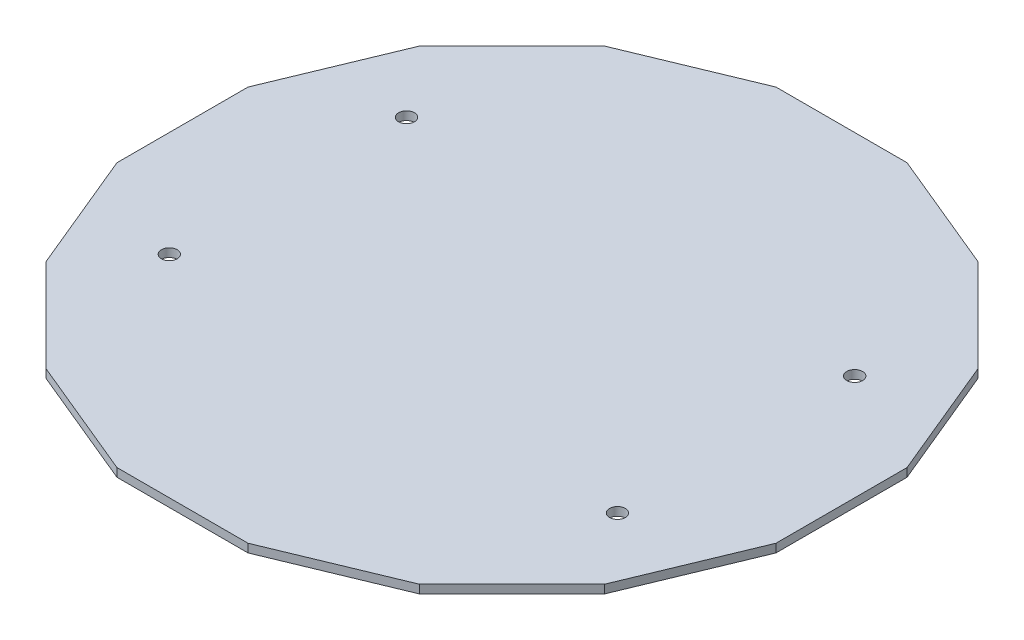
ISO-10303-21;
HEADER;
FILE_DESCRIPTION(('STEP AP214'),'2;1');
FILE_NAME('part.step','',(''),(''),'','','');
FILE_SCHEMA(('AUTOMOTIVE_DESIGN { 1 0 10303 214 1 1 1 1 }'));
ENDSEC;
DATA;
#1=APPLICATION_CONTEXT('core data for automotive mechanical design processes');
#2=APPLICATION_PROTOCOL_DEFINITION('international standard','automotive_design',2000,#1);
#3=PRODUCT_CONTEXT('',#1,'mechanical');
#4=PRODUCT('Part','Part','',(#3));
#5=PRODUCT_RELATED_PRODUCT_CATEGORY('part','',(#4));
#6=PRODUCT_DEFINITION_FORMATION('','',#4);
#7=PRODUCT_DEFINITION_CONTEXT('part definition',#1,'design');
#8=PRODUCT_DEFINITION('design','',#6,#7);
#9=PRODUCT_DEFINITION_SHAPE('','',#8);
#10=(LENGTH_UNIT() NAMED_UNIT(*) SI_UNIT(.MILLI.,.METRE.));
#11=(NAMED_UNIT(*) PLANE_ANGLE_UNIT() SI_UNIT($,.RADIAN.));
#12=(NAMED_UNIT(*) SI_UNIT($,.STERADIAN.) SOLID_ANGLE_UNIT());
#13=UNCERTAINTY_MEASURE_WITH_UNIT(LENGTH_MEASURE(1.E-05),#10,'distance_accuracy_value','');
#14=(GEOMETRIC_REPRESENTATION_CONTEXT(3) GLOBAL_UNCERTAINTY_ASSIGNED_CONTEXT((#13)) GLOBAL_UNIT_ASSIGNED_CONTEXT((#10,
#11,#12)) REPRESENTATION_CONTEXT('',''));
#15=CARTESIAN_POINT('',(0.,0.,0.));
#16=DIRECTION('',(0.,0.,1.));
#17=DIRECTION('',(1.,0.,0.));
#18=AXIS2_PLACEMENT_3D('',#15,#16,#17);
#19=CARTESIAN_POINT('',(62.5,1.6,12.4320229612286));
#20=DIRECTION('',(-1.,0.,0.));
#21=DIRECTION('',(0.,0.,1.));
#22=AXIS2_PLACEMENT_3D('',#19,#20,#21);
#23=PLANE('',#22);
#24=DIRECTION('',(0.,0.,-1.));
#25=VECTOR('',#24,1.);
#26=CARTESIAN_POINT('',(62.5,0.,12.4320229612286));
#27=LINE('',#26,#25);
#28=CARTESIAN_POINT('',(62.5,0.,12.4320229612286));
#29=VERTEX_POINT('',#28);
#30=CARTESIAN_POINT('',(62.5,0.,-12.4320229612286));
#31=VERTEX_POINT('',#30);
#32=EDGE_CURVE('E199',#29,#31,#27,.T.);
#33=ORIENTED_EDGE('',*,*,#32,.T.);
#34=DIRECTION('',(0.,-1.,0.));
#35=VECTOR('',#34,1.);
#36=CARTESIAN_POINT('',(62.5,1.6,-12.4320229612286));
#37=LINE('',#36,#35);
#38=CARTESIAN_POINT('',(62.5,1.6,-12.4320229612286));
#39=VERTEX_POINT('',#38);
#40=EDGE_CURVE('E11',#39,#31,#37,.T.);
#41=ORIENTED_EDGE('',*,*,#40,.F.);
#42=DIRECTION('',(0.,0.,-1.));
#43=VECTOR('',#42,1.);
#44=CARTESIAN_POINT('',(62.5,1.6,12.4320229612286));
#45=LINE('',#44,#43);
#46=CARTESIAN_POINT('',(62.5,1.6,12.4320229612286));
#47=VERTEX_POINT('',#46);
#48=EDGE_CURVE('E246',#47,#39,#45,.T.);
#49=ORIENTED_EDGE('',*,*,#48,.F.);
#50=DIRECTION('',(0.,-1.,0.));
#51=VECTOR('',#50,1.);
#52=CARTESIAN_POINT('',(62.5,1.6,12.4320229612286));
#53=LINE('',#52,#51);
#54=EDGE_CURVE('E195',#47,#29,#53,.T.);
#55=ORIENTED_EDGE('',*,*,#54,.T.);
#56=EDGE_LOOP('',(#33,#41,#49,#55));
#57=FACE_BOUND('',#56,.T.);
#58=ADVANCED_FACE('F50',(#57),#23,.F.);
#59=CARTESIAN_POINT('',(62.5,1.6,-12.4320229612286));
#60=DIRECTION('',(-0.923879532511287,0.,0.38268343236509));
#61=DIRECTION('',(0.38268343236509,0.,0.923879532511287));
#62=AXIS2_PLACEMENT_3D('',#59,#60,#61);
#63=PLANE('',#62);
#64=DIRECTION('',(-0.38268343236509,0.,-0.923879532511287));
#65=VECTOR('',#64,1.);
#66=CARTESIAN_POINT('',(62.5,0.,-12.4320229612286));
#67=LINE('',#66,#65);
#68=CARTESIAN_POINT('',(52.9849415639108,0.,-35.4034060844076));
#69=VERTEX_POINT('',#68);
#70=EDGE_CURVE('E203',#31,#69,#67,.T.);
#71=ORIENTED_EDGE('',*,*,#70,.T.);
#72=DIRECTION('',(0.,-1.,0.));
#73=VECTOR('',#72,1.);
#74=CARTESIAN_POINT('',(52.9849415639108,1.6,-35.4034060844076));
#75=LINE('',#74,#73);
#76=CARTESIAN_POINT('',(52.9849415639108,1.6,-35.4034060844076));
#77=VERTEX_POINT('',#76);
#78=EDGE_CURVE('E59',#77,#69,#75,.T.);
#79=ORIENTED_EDGE('',*,*,#78,.F.);
#80=DIRECTION('',(-0.38268343236509,0.,-0.923879532511287));
#81=VECTOR('',#80,1.);
#82=CARTESIAN_POINT('',(62.5,1.6,-12.4320229612286));
#83=LINE('',#82,#81);
#84=EDGE_CURVE('E134',#39,#77,#83,.T.);
#85=ORIENTED_EDGE('',*,*,#84,.F.);
#86=ORIENTED_EDGE('',*,*,#40,.T.);
#87=EDGE_LOOP('',(#71,#79,#85,#86));
#88=FACE_BOUND('',#87,.T.);
#89=ADVANCED_FACE('F369',(#88),#63,.F.);
#90=CARTESIAN_POINT('',(52.9849415639108,1.6,-35.4034060844076));
#91=DIRECTION('',(-0.707106781186548,0.,0.707106781186548));
#92=DIRECTION('',(0.707106781186548,0.,0.707106781186548));
#93=AXIS2_PLACEMENT_3D('',#90,#91,#92);
#94=PLANE('',#93);
#95=DIRECTION('',(-0.707106781186547,0.,-0.707106781186547));
#96=VECTOR('',#95,1.);
#97=CARTESIAN_POINT('',(52.9849415639108,0.,-35.4034060844076));
#98=LINE('',#97,#96);
#99=CARTESIAN_POINT('',(35.4034060844076,0.,-52.9849415639108));
#100=VERTEX_POINT('',#99);
#101=EDGE_CURVE('E207',#69,#100,#98,.T.);
#102=ORIENTED_EDGE('',*,*,#101,.T.);
#103=DIRECTION('',(0.,-1.,0.));
#104=VECTOR('',#103,1.);
#105=CARTESIAN_POINT('',(35.4034060844076,1.6,-52.9849415639108));
#106=LINE('',#105,#104);
#107=CARTESIAN_POINT('',(35.4034060844076,1.6,-52.9849415639108));
#108=VERTEX_POINT('',#107);
#109=EDGE_CURVE('E289',#108,#100,#106,.T.);
#110=ORIENTED_EDGE('',*,*,#109,.F.);
#111=DIRECTION('',(-0.707106781186547,0.,-0.707106781186547));
#112=VECTOR('',#111,1.);
#113=CARTESIAN_POINT('',(52.9849415639108,1.6,-35.4034060844076));
#114=LINE('',#113,#112);
#115=EDGE_CURVE('E299',#77,#108,#114,.T.);
#116=ORIENTED_EDGE('',*,*,#115,.F.);
#117=ORIENTED_EDGE('',*,*,#78,.T.);
#118=EDGE_LOOP('',(#102,#110,#116,#117));
#119=FACE_BOUND('',#118,.T.);
#120=ADVANCED_FACE('F297',(#119),#94,.F.);
#121=CARTESIAN_POINT('',(35.4034060844076,1.6,-52.9849415639108));
#122=DIRECTION('',(-0.382683432365089,0.,0.923879532511287));
#123=DIRECTION('',(0.923879532511287,0.,0.382683432365089));
#124=AXIS2_PLACEMENT_3D('',#121,#122,#123);
#125=PLANE('',#124);
#126=DIRECTION('',(-0.923879532511287,0.,-0.382683432365089));
#127=VECTOR('',#126,1.);
#128=CARTESIAN_POINT('',(35.4034060844076,0.,-52.9849415639108));
#129=LINE('',#128,#127);
#130=CARTESIAN_POINT('',(12.4320229612286,0.,-62.5));
#131=VERTEX_POINT('',#130);
#132=EDGE_CURVE('E210',#100,#131,#129,.T.);
#133=ORIENTED_EDGE('',*,*,#132,.T.);
#134=DIRECTION('',(0.,-1.,0.));
#135=VECTOR('',#134,1.);
#136=CARTESIAN_POINT('',(12.4320229612286,1.6,-62.5));
#137=LINE('',#136,#135);
#138=CARTESIAN_POINT('',(12.4320229612286,1.6,-62.5));
#139=VERTEX_POINT('',#138);
#140=EDGE_CURVE('E285',#139,#131,#137,.T.);
#141=ORIENTED_EDGE('',*,*,#140,.F.);
#142=DIRECTION('',(-0.923879532511287,0.,-0.382683432365089));
#143=VECTOR('',#142,1.);
#144=CARTESIAN_POINT('',(35.4034060844076,1.6,-52.9849415639108));
#145=LINE('',#144,#143);
#146=EDGE_CURVE('E318',#108,#139,#145,.T.);
#147=ORIENTED_EDGE('',*,*,#146,.F.);
#148=ORIENTED_EDGE('',*,*,#109,.T.);
#149=EDGE_LOOP('',(#133,#141,#147,#148));
#150=FACE_BOUND('',#149,.T.);
#151=ADVANCED_FACE('F308',(#150),#125,.F.);
#152=CARTESIAN_POINT('',(12.4320229612286,1.6,-62.5));
#153=DIRECTION('',(0.,0.,1.));
#154=DIRECTION('',(1.,0.,0.));
#155=AXIS2_PLACEMENT_3D('',#152,#153,#154);
#156=PLANE('',#155);
#157=DIRECTION('',(-1.,0.,0.));
#158=VECTOR('',#157,1.);
#159=CARTESIAN_POINT('',(12.4320229612286,0.,-62.5));
#160=LINE('',#159,#158);
#161=CARTESIAN_POINT('',(-12.4320229612286,0.,-62.5));
#162=VERTEX_POINT('',#161);
#163=EDGE_CURVE('E213',#131,#162,#160,.T.);
#164=ORIENTED_EDGE('',*,*,#163,.T.);
#165=DIRECTION('',(0.,-1.,0.));
#166=VECTOR('',#165,1.);
#167=CARTESIAN_POINT('',(-12.4320229612286,1.6,-62.5));
#168=LINE('',#167,#166);
#169=CARTESIAN_POINT('',(-12.4320229612286,1.6,-62.5));
#170=VERTEX_POINT('',#169);
#171=EDGE_CURVE('E281',#170,#162,#168,.T.);
#172=ORIENTED_EDGE('',*,*,#171,.F.);
#173=DIRECTION('',(-1.,0.,0.));
#174=VECTOR('',#173,1.);
#175=CARTESIAN_POINT('',(12.4320229612286,1.6,-62.5));
#176=LINE('',#175,#174);
#177=EDGE_CURVE('E314',#139,#170,#176,.T.);
#178=ORIENTED_EDGE('',*,*,#177,.F.);
#179=ORIENTED_EDGE('',*,*,#140,.T.);
#180=EDGE_LOOP('',(#164,#172,#178,#179));
#181=FACE_BOUND('',#180,.T.);
#182=ADVANCED_FACE('F312',(#181),#156,.F.);
#183=CARTESIAN_POINT('',(-12.4320229612286,1.6,-62.5));
#184=DIRECTION('',(0.38268343236509,0.,0.923879532511287));
#185=DIRECTION('',(0.923879532511287,0.,-0.38268343236509));
#186=AXIS2_PLACEMENT_3D('',#183,#184,#185);
#187=PLANE('',#186);
#188=DIRECTION('',(-0.923879532511287,0.,0.38268343236509));
#189=VECTOR('',#188,1.);
#190=CARTESIAN_POINT('',(-12.4320229612286,0.,-62.5));
#191=LINE('',#190,#189);
#192=CARTESIAN_POINT('',(-35.4034060844076,0.,-52.9849415639108));
#193=VERTEX_POINT('',#192);
#194=EDGE_CURVE('E216',#162,#193,#191,.T.);
#195=ORIENTED_EDGE('',*,*,#194,.T.);
#196=DIRECTION('',(0.,-1.,0.));
#197=VECTOR('',#196,1.);
#198=CARTESIAN_POINT('',(-35.4034060844076,1.6,-52.9849415639108));
#199=LINE('',#198,#197);
#200=CARTESIAN_POINT('',(-35.4034060844076,1.6,-52.9849415639108));
#201=VERTEX_POINT('',#200);
#202=EDGE_CURVE('E277',#201,#193,#199,.T.);
#203=ORIENTED_EDGE('',*,*,#202,.F.);
#204=DIRECTION('',(-0.923879532511287,0.,0.38268343236509));
#205=VECTOR('',#204,1.);
#206=CARTESIAN_POINT('',(-12.4320229612286,1.6,-62.5));
#207=LINE('',#206,#205);
#208=EDGE_CURVE('E317',#170,#201,#207,.T.);
#209=ORIENTED_EDGE('',*,*,#208,.F.);
#210=ORIENTED_EDGE('',*,*,#171,.T.);
#211=EDGE_LOOP('',(#195,#203,#209,#210));
#212=FACE_BOUND('',#211,.T.);
#213=ADVANCED_FACE('F382',(#212),#187,.F.);
#214=CARTESIAN_POINT('',(-35.4034060844076,1.6,-52.9849415639108));
#215=DIRECTION('',(0.707106781186548,0.,0.707106781186547));
#216=DIRECTION('',(0.707106781186547,0.,-0.707106781186548));
#217=AXIS2_PLACEMENT_3D('',#214,#215,#216);
#218=PLANE('',#217);
#219=DIRECTION('',(-0.707106781186547,0.,0.707106781186548));
#220=VECTOR('',#219,1.);
#221=CARTESIAN_POINT('',(-35.4034060844076,0.,-52.9849415639108));
#222=LINE('',#221,#220);
#223=CARTESIAN_POINT('',(-52.9849415639109,0.,-35.4034060844075));
#224=VERTEX_POINT('',#223);
#225=EDGE_CURVE('E219',#193,#224,#222,.T.);
#226=ORIENTED_EDGE('',*,*,#225,.T.);
#227=DIRECTION('',(0.,-1.,0.));
#228=VECTOR('',#227,1.);
#229=CARTESIAN_POINT('',(-52.9849415639109,1.6,-35.4034060844075));
#230=LINE('',#229,#228);
#231=CARTESIAN_POINT('',(-52.9849415639109,1.6,-35.4034060844075));
#232=VERTEX_POINT('',#231);
#233=EDGE_CURVE('E273',#232,#224,#230,.T.);
#234=ORIENTED_EDGE('',*,*,#233,.F.);
#235=DIRECTION('',(-0.707106781186547,0.,0.707106781186548));
#236=VECTOR('',#235,1.);
#237=CARTESIAN_POINT('',(-35.4034060844076,1.6,-52.9849415639108));
#238=LINE('',#237,#236);
#239=EDGE_CURVE('E322',#201,#232,#238,.T.);
#240=ORIENTED_EDGE('',*,*,#239,.F.);
#241=ORIENTED_EDGE('',*,*,#202,.T.);
#242=EDGE_LOOP('',(#226,#234,#240,#241));
#243=FACE_BOUND('',#242,.T.);
#244=ADVANCED_FACE('F385',(#243),#218,.F.);
#245=CARTESIAN_POINT('',(-52.9849415639109,1.6,-35.4034060844075));
#246=DIRECTION('',(0.923879532511287,0.,0.382683432365089));
#247=DIRECTION('',(0.38268343236509,0.,-0.923879532511287));
#248=AXIS2_PLACEMENT_3D('',#245,#246,#247);
#249=PLANE('',#248);
#250=DIRECTION('',(-0.382683432365089,0.,0.923879532511287));
#251=VECTOR('',#250,1.);
#252=CARTESIAN_POINT('',(-52.9849415639109,0.,-35.4034060844075));
#253=LINE('',#252,#251);
#254=CARTESIAN_POINT('',(-62.5,0.,-12.4320229612286));
#255=VERTEX_POINT('',#254);
#256=EDGE_CURVE('E222',#224,#255,#253,.T.);
#257=ORIENTED_EDGE('',*,*,#256,.T.);
#258=DIRECTION('',(0.,-1.,0.));
#259=VECTOR('',#258,1.);
#260=CARTESIAN_POINT('',(-62.5,1.6,-12.4320229612286));
#261=LINE('',#260,#259);
#262=CARTESIAN_POINT('',(-62.5,1.6,-12.4320229612286));
#263=VERTEX_POINT('',#262);
#264=EDGE_CURVE('E269',#263,#255,#261,.T.);
#265=ORIENTED_EDGE('',*,*,#264,.F.);
#266=DIRECTION('',(-0.382683432365089,0.,0.923879532511287));
#267=VECTOR('',#266,1.);
#268=CARTESIAN_POINT('',(-52.9849415639109,1.6,-35.4034060844075));
#269=LINE('',#268,#267);
#270=EDGE_CURVE('E329',#232,#263,#269,.T.);
#271=ORIENTED_EDGE('',*,*,#270,.F.);
#272=ORIENTED_EDGE('',*,*,#233,.T.);
#273=EDGE_LOOP('',(#257,#265,#271,#272));
#274=FACE_BOUND('',#273,.T.);
#275=ADVANCED_FACE('F389',(#274),#249,.F.);
#276=CARTESIAN_POINT('',(-62.5,1.6,-12.4320229612286));
#277=DIRECTION('',(1.,0.,0.));
#278=DIRECTION('',(0.,0.,-1.));
#279=AXIS2_PLACEMENT_3D('',#276,#277,#278);
#280=PLANE('',#279);
#281=DIRECTION('',(0.,0.,1.));
#282=VECTOR('',#281,1.);
#283=CARTESIAN_POINT('',(-62.5,0.,-12.4320229612286));
#284=LINE('',#283,#282);
#285=CARTESIAN_POINT('',(-62.5,0.,12.4320229612287));
#286=VERTEX_POINT('',#285);
#287=EDGE_CURVE('E225',#255,#286,#284,.T.);
#288=ORIENTED_EDGE('',*,*,#287,.T.);
#289=DIRECTION('',(0.,-1.,0.));
#290=VECTOR('',#289,1.);
#291=CARTESIAN_POINT('',(-62.5,1.6,12.4320229612287));
#292=LINE('',#291,#290);
#293=CARTESIAN_POINT('',(-62.5,1.6,12.4320229612287));
#294=VERTEX_POINT('',#293);
#295=EDGE_CURVE('E265',#294,#286,#292,.T.);
#296=ORIENTED_EDGE('',*,*,#295,.F.);
#297=DIRECTION('',(0.,0.,1.));
#298=VECTOR('',#297,1.);
#299=CARTESIAN_POINT('',(-62.5,1.6,-12.4320229612286));
#300=LINE('',#299,#298);
#301=EDGE_CURVE('E332',#263,#294,#300,.T.);
#302=ORIENTED_EDGE('',*,*,#301,.F.);
#303=ORIENTED_EDGE('',*,*,#264,.T.);
#304=EDGE_LOOP('',(#288,#296,#302,#303));
#305=FACE_BOUND('',#304,.T.);
#306=ADVANCED_FACE('F393',(#305),#280,.F.);
#307=CARTESIAN_POINT('',(-62.5,1.6,12.4320229612287));
#308=DIRECTION('',(0.923879532511287,0.,-0.38268343236509));
#309=DIRECTION('',(-0.38268343236509,0.,-0.923879532511287));
#310=AXIS2_PLACEMENT_3D('',#307,#308,#309);
#311=PLANE('',#310);
#312=DIRECTION('',(0.38268343236509,0.,0.923879532511287));
#313=VECTOR('',#312,1.);
#314=CARTESIAN_POINT('',(-62.5,0.,12.4320229612287));
#315=LINE('',#314,#313);
#316=CARTESIAN_POINT('',(-52.9849415639108,0.,35.4034060844077));
#317=VERTEX_POINT('',#316);
#318=EDGE_CURVE('E228',#286,#317,#315,.T.);
#319=ORIENTED_EDGE('',*,*,#318,.T.);
#320=DIRECTION('',(0.,-1.,0.));
#321=VECTOR('',#320,1.);
#322=CARTESIAN_POINT('',(-52.9849415639108,1.6,35.4034060844077));
#323=LINE('',#322,#321);
#324=CARTESIAN_POINT('',(-52.9849415639108,1.6,35.4034060844077));
#325=VERTEX_POINT('',#324);
#326=EDGE_CURVE('E261',#325,#317,#323,.T.);
#327=ORIENTED_EDGE('',*,*,#326,.F.);
#328=DIRECTION('',(0.38268343236509,0.,0.923879532511287));
#329=VECTOR('',#328,1.);
#330=CARTESIAN_POINT('',(-62.5,1.6,12.4320229612287));
#331=LINE('',#330,#329);
#332=EDGE_CURVE('E335',#294,#325,#331,.T.);
#333=ORIENTED_EDGE('',*,*,#332,.F.);
#334=ORIENTED_EDGE('',*,*,#295,.T.);
#335=EDGE_LOOP('',(#319,#327,#333,#334));
#336=FACE_BOUND('',#335,.T.);
#337=ADVANCED_FACE('F397',(#336),#311,.F.);
#338=CARTESIAN_POINT('',(-52.9849415639108,1.6,35.4034060844077));
#339=DIRECTION('',(0.707106781186547,0.,-0.707106781186548));
#340=DIRECTION('',(-0.707106781186548,0.,-0.707106781186547));
#341=AXIS2_PLACEMENT_3D('',#338,#339,#340);
#342=PLANE('',#341);
#343=DIRECTION('',(0.707106781186548,0.,0.707106781186547));
#344=VECTOR('',#343,1.);
#345=CARTESIAN_POINT('',(-52.9849415639108,0.,35.4034060844077));
#346=LINE('',#345,#344);
#347=CARTESIAN_POINT('',(-35.4034060844076,0.,52.9849415639109));
#348=VERTEX_POINT('',#347);
#349=EDGE_CURVE('E231',#317,#348,#346,.T.);
#350=ORIENTED_EDGE('',*,*,#349,.T.);
#351=DIRECTION('',(0.,-1.,0.));
#352=VECTOR('',#351,1.);
#353=CARTESIAN_POINT('',(-35.4034060844076,1.6,52.9849415639109));
#354=LINE('',#353,#352);
#355=CARTESIAN_POINT('',(-35.4034060844076,1.6,52.9849415639109));
#356=VERTEX_POINT('',#355);
#357=EDGE_CURVE('E257',#356,#348,#354,.T.);
#358=ORIENTED_EDGE('',*,*,#357,.F.);
#359=DIRECTION('',(0.707106781186548,0.,0.707106781186547));
#360=VECTOR('',#359,1.);
#361=CARTESIAN_POINT('',(-52.9849415639108,1.6,35.4034060844077));
#362=LINE('',#361,#360);
#363=EDGE_CURVE('E338',#325,#356,#362,.T.);
#364=ORIENTED_EDGE('',*,*,#363,.F.);
#365=ORIENTED_EDGE('',*,*,#326,.T.);
#366=EDGE_LOOP('',(#350,#358,#364,#365));
#367=FACE_BOUND('',#366,.T.);
#368=ADVANCED_FACE('F401',(#367),#342,.F.);
#369=CARTESIAN_POINT('',(-35.4034060844076,1.6,52.9849415639109));
#370=DIRECTION('',(0.382683432365089,0.,-0.923879532511287));
#371=DIRECTION('',(-0.923879532511287,0.,-0.382683432365089));
#372=AXIS2_PLACEMENT_3D('',#369,#370,#371);
#373=PLANE('',#372);
#374=DIRECTION('',(0.923879532511287,0.,0.382683432365089));
#375=VECTOR('',#374,1.);
#376=CARTESIAN_POINT('',(-35.4034060844076,0.,52.9849415639109));
#377=LINE('',#376,#375);
#378=CARTESIAN_POINT('',(-12.4320229612286,0.,62.5));
#379=VERTEX_POINT('',#378);
#380=EDGE_CURVE('E234',#348,#379,#377,.T.);
#381=ORIENTED_EDGE('',*,*,#380,.T.);
#382=DIRECTION('',(0.,-1.,0.));
#383=VECTOR('',#382,1.);
#384=CARTESIAN_POINT('',(-12.4320229612286,1.6,62.5));
#385=LINE('',#384,#383);
#386=CARTESIAN_POINT('',(-12.4320229612286,1.6,62.5));
#387=VERTEX_POINT('',#386);
#388=EDGE_CURVE('E253',#387,#379,#385,.T.);
#389=ORIENTED_EDGE('',*,*,#388,.F.);
#390=DIRECTION('',(0.923879532511287,0.,0.382683432365089));
#391=VECTOR('',#390,1.);
#392=CARTESIAN_POINT('',(-35.4034060844076,1.6,52.9849415639109));
#393=LINE('',#392,#391);
#394=EDGE_CURVE('E341',#356,#387,#393,.T.);
#395=ORIENTED_EDGE('',*,*,#394,.F.);
#396=ORIENTED_EDGE('',*,*,#357,.T.);
#397=EDGE_LOOP('',(#381,#389,#395,#396));
#398=FACE_BOUND('',#397,.T.);
#399=ADVANCED_FACE('F349',(#398),#373,.F.);
#400=CARTESIAN_POINT('',(-12.4320229612286,1.6,62.5));
#401=DIRECTION('',(0.,0.,-1.));
#402=DIRECTION('',(-1.,0.,0.));
#403=AXIS2_PLACEMENT_3D('',#400,#401,#402);
#404=PLANE('',#403);
#405=DIRECTION('',(1.,0.,0.));
#406=VECTOR('',#405,1.);
#407=CARTESIAN_POINT('',(-12.4320229612286,0.,62.5));
#408=LINE('',#407,#406);
#409=CARTESIAN_POINT('',(12.4320229612287,0.,62.5));
#410=VERTEX_POINT('',#409);
#411=EDGE_CURVE('E237',#379,#410,#408,.T.);
#412=ORIENTED_EDGE('',*,*,#411,.T.);
#413=DIRECTION('',(0.,-1.,0.));
#414=VECTOR('',#413,1.);
#415=CARTESIAN_POINT('',(12.4320229612287,1.6,62.5));
#416=LINE('',#415,#414);
#417=CARTESIAN_POINT('',(12.4320229612287,1.6,62.5));
#418=VERTEX_POINT('',#417);
#419=EDGE_CURVE('E188',#418,#410,#416,.T.);
#420=ORIENTED_EDGE('',*,*,#419,.F.);
#421=DIRECTION('',(1.,0.,0.));
#422=VECTOR('',#421,1.);
#423=CARTESIAN_POINT('',(-12.4320229612286,1.6,62.5));
#424=LINE('',#423,#422);
#425=EDGE_CURVE('E177',#387,#418,#424,.T.);
#426=ORIENTED_EDGE('',*,*,#425,.F.);
#427=ORIENTED_EDGE('',*,*,#388,.T.);
#428=EDGE_LOOP('',(#412,#420,#426,#427));
#429=FACE_BOUND('',#428,.T.);
#430=ADVANCED_FACE('F353',(#429),#404,.F.);
#431=CARTESIAN_POINT('',(12.4320229612287,1.6,62.5));
#432=DIRECTION('',(-0.382683432365089,0.,-0.923879532511287));
#433=DIRECTION('',(-0.923879532511287,0.,0.382683432365089));
#434=AXIS2_PLACEMENT_3D('',#431,#432,#433);
#435=PLANE('',#434);
#436=DIRECTION('',(0.923879532511287,0.,-0.382683432365089));
#437=VECTOR('',#436,1.);
#438=CARTESIAN_POINT('',(12.4320229612287,0.,62.5));
#439=LINE('',#438,#437);
#440=CARTESIAN_POINT('',(35.4034060844076,0.,52.9849415639109));
#441=VERTEX_POINT('',#440);
#442=EDGE_CURVE('E186',#410,#441,#439,.T.);
#443=ORIENTED_EDGE('',*,*,#442,.T.);
#444=DIRECTION('',(0.,-1.,0.));
#445=VECTOR('',#444,1.);
#446=CARTESIAN_POINT('',(35.4034060844076,1.6,52.9849415639109));
#447=LINE('',#446,#445);
#448=CARTESIAN_POINT('',(35.4034060844076,1.6,52.9849415639109));
#449=VERTEX_POINT('',#448);
#450=EDGE_CURVE('E183',#449,#441,#447,.T.);
#451=ORIENTED_EDGE('',*,*,#450,.F.);
#452=DIRECTION('',(0.923879532511287,0.,-0.382683432365089));
#453=VECTOR('',#452,1.);
#454=CARTESIAN_POINT('',(12.4320229612287,1.6,62.5));
#455=LINE('',#454,#453);
#456=EDGE_CURVE('E171',#418,#449,#455,.T.);
#457=ORIENTED_EDGE('',*,*,#456,.F.);
#458=ORIENTED_EDGE('',*,*,#419,.T.);
#459=EDGE_LOOP('',(#443,#451,#457,#458));
#460=FACE_BOUND('',#459,.T.);
#461=ADVANCED_FACE('F184',(#460),#435,.F.);
#462=CARTESIAN_POINT('',(35.4034060844076,1.6,52.9849415639109));
#463=DIRECTION('',(-0.707106781186548,0.,-0.707106781186547));
#464=DIRECTION('',(-0.707106781186547,0.,0.707106781186548));
#465=AXIS2_PLACEMENT_3D('',#462,#463,#464);
#466=PLANE('',#465);
#467=DIRECTION('',(0.707106781186547,0.,-0.707106781186548));
#468=VECTOR('',#467,1.);
#469=CARTESIAN_POINT('',(35.4034060844076,0.,52.9849415639109));
#470=LINE('',#469,#468);
#471=CARTESIAN_POINT('',(52.9849415639109,0.,35.4034060844076));
#472=VERTEX_POINT('',#471);
#473=EDGE_CURVE('E120',#441,#472,#470,.T.);
#474=ORIENTED_EDGE('',*,*,#473,.T.);
#475=DIRECTION('',(0.,-1.,0.));
#476=VECTOR('',#475,1.);
#477=CARTESIAN_POINT('',(52.9849415639109,1.6,35.4034060844076));
#478=LINE('',#477,#476);
#479=CARTESIAN_POINT('',(52.9849415639109,1.6,35.4034060844076));
#480=VERTEX_POINT('',#479);
#481=EDGE_CURVE('E189',#480,#472,#478,.T.);
#482=ORIENTED_EDGE('',*,*,#481,.F.);
#483=DIRECTION('',(0.707106781186547,0.,-0.707106781186548));
#484=VECTOR('',#483,1.);
#485=CARTESIAN_POINT('',(35.4034060844076,1.6,52.9849415639109));
#486=LINE('',#485,#484);
#487=EDGE_CURVE('E175',#449,#480,#486,.T.);
#488=ORIENTED_EDGE('',*,*,#487,.F.);
#489=ORIENTED_EDGE('',*,*,#450,.T.);
#490=EDGE_LOOP('',(#474,#482,#488,#489));
#491=FACE_BOUND('',#490,.T.);
#492=ADVANCED_FACE('F191',(#491),#466,.F.);
#493=CARTESIAN_POINT('',(52.9849415639109,1.6,35.4034060844076));
#494=DIRECTION('',(-0.923879532511287,0.,-0.38268343236509));
#495=DIRECTION('',(-0.38268343236509,0.,0.923879532511287));
#496=AXIS2_PLACEMENT_3D('',#493,#494,#495);
#497=PLANE('',#496);
#498=DIRECTION('',(0.38268343236509,0.,-0.923879532511287));
#499=VECTOR('',#498,1.);
#500=CARTESIAN_POINT('',(52.9849415639109,0.,35.4034060844076));
#501=LINE('',#500,#499);
#502=EDGE_CURVE('E126',#472,#29,#501,.T.);
#503=ORIENTED_EDGE('',*,*,#502,.T.);
#504=ORIENTED_EDGE('',*,*,#54,.F.);
#505=DIRECTION('',(0.38268343236509,0.,-0.923879532511287));
#506=VECTOR('',#505,1.);
#507=CARTESIAN_POINT('',(52.9849415639109,1.6,35.4034060844076));
#508=LINE('',#507,#506);
#509=EDGE_CURVE('E67',#480,#47,#508,.T.);
#510=ORIENTED_EDGE('',*,*,#509,.F.);
#511=ORIENTED_EDGE('',*,*,#481,.T.);
#512=EDGE_LOOP('',(#503,#504,#510,#511));
#513=FACE_BOUND('',#512,.T.);
#514=ADVANCED_FACE('F357',(#513),#497,.F.);
#515=CARTESIAN_POINT('',(0.,1.6,0.));
#516=DIRECTION('',(0.,1.,0.));
#517=DIRECTION('',(0.,0.,1.));
#518=AXIS2_PLACEMENT_3D('',#515,#516,#517);
#519=PLANE('',#518);
#520=CARTESIAN_POINT('',(42.5,1.6,-22.5));
#521=DIRECTION('',(0.,1.,0.));
#522=DIRECTION('',(0.,0.,1.));
#523=AXIS2_PLACEMENT_3D('',#520,#521,#522);
#524=CIRCLE('',#523,1.5);
#525=CARTESIAN_POINT('',(42.5,1.6,-21.));
#526=VERTEX_POINT('',#525);
#527=EDGE_CURVE('E649',#526,#526,#524,.T.);
#528=ORIENTED_EDGE('',*,*,#527,.F.);
#529=EDGE_LOOP('',(#528));
#530=FACE_BOUND('',#529,.T.);
#531=CARTESIAN_POINT('',(42.5,1.6,22.5));
#532=DIRECTION('',(0.,1.,0.));
#533=DIRECTION('',(0.,0.,1.));
#534=AXIS2_PLACEMENT_3D('',#531,#532,#533);
#535=CIRCLE('',#534,1.5);
#536=CARTESIAN_POINT('',(42.5,1.6,24.));
#537=VERTEX_POINT('',#536);
#538=EDGE_CURVE('E656',#537,#537,#535,.T.);
#539=ORIENTED_EDGE('',*,*,#538,.F.);
#540=EDGE_LOOP('',(#539));
#541=FACE_BOUND('',#540,.T.);
#542=CARTESIAN_POINT('',(-42.5,1.6,22.5));
#543=DIRECTION('',(0.,1.,0.));
#544=DIRECTION('',(0.,0.,1.));
#545=AXIS2_PLACEMENT_3D('',#542,#543,#544);
#546=CIRCLE('',#545,1.5);
#547=CARTESIAN_POINT('',(-42.5,1.6,24.));
#548=VERTEX_POINT('',#547);
#549=EDGE_CURVE('E665',#548,#548,#546,.T.);
#550=ORIENTED_EDGE('',*,*,#549,.F.);
#551=EDGE_LOOP('',(#550));
#552=FACE_BOUND('',#551,.T.);
#553=CARTESIAN_POINT('',(-42.5,1.6,-22.5));
#554=DIRECTION('',(0.,1.,0.));
#555=DIRECTION('',(0.,0.,1.));
#556=AXIS2_PLACEMENT_3D('',#553,#554,#555);
#557=CIRCLE('',#556,1.5);
#558=CARTESIAN_POINT('',(-42.5,1.6,-21.));
#559=VERTEX_POINT('',#558);
#560=EDGE_CURVE('E661',#559,#559,#557,.T.);
#561=ORIENTED_EDGE('',*,*,#560,.F.);
#562=EDGE_LOOP('',(#561));
#563=FACE_BOUND('',#562,.T.);
#564=ORIENTED_EDGE('',*,*,#48,.T.);
#565=ORIENTED_EDGE('',*,*,#84,.T.);
#566=ORIENTED_EDGE('',*,*,#115,.T.);
#567=ORIENTED_EDGE('',*,*,#146,.T.);
#568=ORIENTED_EDGE('',*,*,#177,.T.);
#569=ORIENTED_EDGE('',*,*,#208,.T.);
#570=ORIENTED_EDGE('',*,*,#239,.T.);
#571=ORIENTED_EDGE('',*,*,#270,.T.);
#572=ORIENTED_EDGE('',*,*,#301,.T.);
#573=ORIENTED_EDGE('',*,*,#332,.T.);
#574=ORIENTED_EDGE('',*,*,#363,.T.);
#575=ORIENTED_EDGE('',*,*,#394,.T.);
#576=ORIENTED_EDGE('',*,*,#425,.T.);
#577=ORIENTED_EDGE('',*,*,#456,.T.);
#578=ORIENTED_EDGE('',*,*,#487,.T.);
#579=ORIENTED_EDGE('',*,*,#509,.T.);
#580=EDGE_LOOP('',(#564,#565,#566,#567,#568,#569,#570,#571,#572,#573,#574,#575,#576,#577,#578,#579));
#581=FACE_BOUND('',#580,.T.);
#582=ADVANCED_FACE('F173',(#530,#541,#552,#563,#581),#519,.T.);
#583=CARTESIAN_POINT('',(0.,0.,0.));
#584=DIRECTION('',(0.,1.,0.));
#585=DIRECTION('',(0.,0.,1.));
#586=AXIS2_PLACEMENT_3D('',#583,#584,#585);
#587=PLANE('',#586);
#588=CARTESIAN_POINT('',(42.5,0.,-22.5));
#589=DIRECTION('',(0.,1.,0.));
#590=DIRECTION('',(0.,0.,1.));
#591=AXIS2_PLACEMENT_3D('',#588,#589,#590);
#592=CIRCLE('',#591,1.5);
#593=CARTESIAN_POINT('',(42.5,0.,-21.));
#594=VERTEX_POINT('',#593);
#595=EDGE_CURVE('E646',#594,#594,#592,.F.);
#596=ORIENTED_EDGE('',*,*,#595,.F.);
#597=EDGE_LOOP('',(#596));
#598=FACE_BOUND('',#597,.T.);
#599=CARTESIAN_POINT('',(42.5,0.,22.5));
#600=DIRECTION('',(0.,1.,0.));
#601=DIRECTION('',(0.,0.,1.));
#602=AXIS2_PLACEMENT_3D('',#599,#600,#601);
#603=CIRCLE('',#602,1.5);
#604=CARTESIAN_POINT('',(42.5,0.,24.));
#605=VERTEX_POINT('',#604);
#606=EDGE_CURVE('E651',#605,#605,#603,.F.);
#607=ORIENTED_EDGE('',*,*,#606,.F.);
#608=EDGE_LOOP('',(#607));
#609=FACE_BOUND('',#608,.T.);
#610=CARTESIAN_POINT('',(-42.5,0.,22.5));
#611=DIRECTION('',(0.,1.,0.));
#612=DIRECTION('',(0.,0.,1.));
#613=AXIS2_PLACEMENT_3D('',#610,#611,#612);
#614=CIRCLE('',#613,1.5);
#615=CARTESIAN_POINT('',(-42.5,0.,24.));
#616=VERTEX_POINT('',#615);
#617=EDGE_CURVE('E676',#616,#616,#614,.F.);
#618=ORIENTED_EDGE('',*,*,#617,.F.);
#619=EDGE_LOOP('',(#618));
#620=FACE_BOUND('',#619,.T.);
#621=CARTESIAN_POINT('',(-42.5,0.,-22.5));
#622=DIRECTION('',(0.,1.,0.));
#623=DIRECTION('',(0.,0.,1.));
#624=AXIS2_PLACEMENT_3D('',#621,#622,#623);
#625=CIRCLE('',#624,1.5);
#626=CARTESIAN_POINT('',(-42.5,0.,-21.));
#627=VERTEX_POINT('',#626);
#628=EDGE_CURVE('E204',#627,#627,#625,.F.);
#629=ORIENTED_EDGE('',*,*,#628,.F.);
#630=EDGE_LOOP('',(#629));
#631=FACE_BOUND('',#630,.T.);
#632=ORIENTED_EDGE('',*,*,#32,.F.);
#633=ORIENTED_EDGE('',*,*,#502,.F.);
#634=ORIENTED_EDGE('',*,*,#473,.F.);
#635=ORIENTED_EDGE('',*,*,#442,.F.);
#636=ORIENTED_EDGE('',*,*,#411,.F.);
#637=ORIENTED_EDGE('',*,*,#380,.F.);
#638=ORIENTED_EDGE('',*,*,#349,.F.);
#639=ORIENTED_EDGE('',*,*,#318,.F.);
#640=ORIENTED_EDGE('',*,*,#287,.F.);
#641=ORIENTED_EDGE('',*,*,#256,.F.);
#642=ORIENTED_EDGE('',*,*,#225,.F.);
#643=ORIENTED_EDGE('',*,*,#194,.F.);
#644=ORIENTED_EDGE('',*,*,#163,.F.);
#645=ORIENTED_EDGE('',*,*,#132,.F.);
#646=ORIENTED_EDGE('',*,*,#101,.F.);
#647=ORIENTED_EDGE('',*,*,#70,.F.);
#648=EDGE_LOOP('',(#632,#633,#634,#635,#636,#637,#638,#639,#640,#641,#642,#643,#644,#645,#646,#647));
#649=FACE_BOUND('',#648,.T.);
#650=ADVANCED_FACE('F303',(#598,#609,#620,#631,#649),#587,.F.);
#651=CARTESIAN_POINT('',(-42.5,-4.24264068711929,-22.5));
#652=DIRECTION('',(0.,1.,0.));
#653=DIRECTION('',(0.,0.,1.));
#654=AXIS2_PLACEMENT_3D('',#651,#652,#653);
#655=CYLINDRICAL_SURFACE('',#654,1.5);
#656=CARTESIAN_POINT('',(-42.5,0.,-21.));
#657=CARTESIAN_POINT('',(-42.5,0.0166666666666666,-21.));
#658=CARTESIAN_POINT('',(-42.5,0.0333333333333331,-21.));
#659=CARTESIAN_POINT('',(-42.5,0.0666666666666666,-21.));
#660=CARTESIAN_POINT('',(-42.5,0.0833333333333334,-21.));
#661=CARTESIAN_POINT('',(-42.5,0.116666666666667,-21.));
#662=CARTESIAN_POINT('',(-42.5,0.133333333333333,-21.));
#663=CARTESIAN_POINT('',(-42.5,0.166666666666667,-21.));
#664=CARTESIAN_POINT('',(-42.5,0.183333333333334,-21.));
#665=CARTESIAN_POINT('',(-42.5,0.216666666666667,-21.));
#666=CARTESIAN_POINT('',(-42.5,0.233333333333334,-21.));
#667=CARTESIAN_POINT('',(-42.5,0.266666666666667,-21.));
#668=CARTESIAN_POINT('',(-42.5,0.283333333333333,-21.));
#669=CARTESIAN_POINT('',(-42.5,0.316666666666667,-21.));
#670=CARTESIAN_POINT('',(-42.5,0.333333333333334,-21.));
#671=CARTESIAN_POINT('',(-42.5,0.366666666666667,-21.));
#672=CARTESIAN_POINT('',(-42.5,0.383333333333334,-21.));
#673=CARTESIAN_POINT('',(-42.5,0.416666666666667,-21.));
#674=CARTESIAN_POINT('',(-42.5,0.433333333333333,-21.));
#675=CARTESIAN_POINT('',(-42.5,0.466666666666667,-21.));
#676=CARTESIAN_POINT('',(-42.5,0.483333333333334,-21.));
#677=CARTESIAN_POINT('',(-42.5,0.516666666666667,-21.));
#678=CARTESIAN_POINT('',(-42.5,0.533333333333334,-21.));
#679=CARTESIAN_POINT('',(-42.5,0.566666666666667,-21.));
#680=CARTESIAN_POINT('',(-42.5,0.583333333333333,-21.));
#681=CARTESIAN_POINT('',(-42.5,0.616666666666667,-21.));
#682=CARTESIAN_POINT('',(-42.5,0.633333333333334,-21.));
#683=CARTESIAN_POINT('',(-42.5,0.666666666666667,-21.));
#684=CARTESIAN_POINT('',(-42.5,0.683333333333334,-21.));
#685=CARTESIAN_POINT('',(-42.5,0.716666666666667,-21.));
#686=CARTESIAN_POINT('',(-42.5,0.733333333333334,-21.));
#687=CARTESIAN_POINT('',(-42.5,0.766666666666667,-21.));
#688=CARTESIAN_POINT('',(-42.5,0.783333333333334,-21.));
#689=CARTESIAN_POINT('',(-42.5,0.816666666666667,-21.));
#690=CARTESIAN_POINT('',(-42.5,0.833333333333333,-21.));
#691=CARTESIAN_POINT('',(-42.5,0.866666666666667,-21.));
#692=CARTESIAN_POINT('',(-42.5,0.883333333333334,-21.));
#693=CARTESIAN_POINT('',(-42.5,0.916666666666667,-21.));
#694=CARTESIAN_POINT('',(-42.5,0.933333333333334,-21.));
#695=CARTESIAN_POINT('',(-42.5,0.966666666666667,-21.));
#696=CARTESIAN_POINT('',(-42.5,0.983333333333334,-21.));
#697=CARTESIAN_POINT('',(-42.5,1.01666666666667,-21.));
#698=CARTESIAN_POINT('',(-42.5,1.03333333333333,-21.));
#699=CARTESIAN_POINT('',(-42.5,1.06666666666667,-21.));
#700=CARTESIAN_POINT('',(-42.5,1.08333333333333,-21.));
#701=CARTESIAN_POINT('',(-42.5,1.11666666666667,-21.));
#702=CARTESIAN_POINT('',(-42.5,1.13333333333333,-21.));
#703=CARTESIAN_POINT('',(-42.5,1.16666666666667,-21.));
#704=CARTESIAN_POINT('',(-42.5,1.18333333333333,-21.));
#705=CARTESIAN_POINT('',(-42.5,1.21666666666667,-21.));
#706=CARTESIAN_POINT('',(-42.5,1.23333333333333,-21.));
#707=CARTESIAN_POINT('',(-42.5,1.26666666666667,-21.));
#708=CARTESIAN_POINT('',(-42.5,1.28333333333333,-21.));
#709=CARTESIAN_POINT('',(-42.5,1.31666666666667,-21.));
#710=CARTESIAN_POINT('',(-42.5,1.33333333333333,-21.));
#711=CARTESIAN_POINT('',(-42.5,1.36666666666667,-21.));
#712=CARTESIAN_POINT('',(-42.5,1.38333333333333,-21.));
#713=CARTESIAN_POINT('',(-42.5,1.41666666666667,-21.));
#714=CARTESIAN_POINT('',(-42.5,1.43333333333333,-21.));
#715=CARTESIAN_POINT('',(-42.5,1.46666666666667,-21.));
#716=CARTESIAN_POINT('',(-42.5,1.48333333333333,-21.));
#717=CARTESIAN_POINT('',(-42.5,1.51666666666667,-21.));
#718=CARTESIAN_POINT('',(-42.5,1.53333333333333,-21.));
#719=CARTESIAN_POINT('',(-42.5,1.56666666666667,-21.));
#720=CARTESIAN_POINT('',(-42.5,1.58333333333333,-21.));
#721=CARTESIAN_POINT('',(-42.5,1.6,-21.));
#722=B_SPLINE_CURVE_WITH_KNOTS('',3,(#656,#657,#658,#659,#660,#661,#662,#663,#664,#665,#666,
#667,#668,#669,#670,#671,#672,#673,#674,#675,#676,#677,#678,#679,#680,#681,#682,#683,#684,#685,
#686,#687,#688,#689,#690,#691,#692,#693,#694,#695,#696,#697,#698,#699,#700,#701,#702,#703,#704,
#705,#706,#707,#708,#709,#710,#711,#712,#713,#714,#715,#716,#717,#718,#719,#720,#721),
.UNSPECIFIED.,.F.,.F.,(4,2,2,2,2,2,2,2,2,2,2,2,2,2,2,2,2,2,2,2,2,2,2,2,2,2,2,2,2,2,2,2,4),(0.,
0.0499999999999997,0.1,0.15,0.200000000000001,0.25,0.3,0.35,0.4,0.45,0.5,0.55,0.6,0.65,0.7,
0.750000000000001,0.8,0.85,0.900000000000001,0.95,1.,1.05,1.1,1.15,1.2,1.25,1.3,1.35,1.4,1.45,
1.5,1.55,1.6),.UNSPECIFIED.);
#723=EDGE_CURVE('BSEAM438',#627,#559,#722,.T.);
#724=ORIENTED_EDGE('',*,*,#628,.T.);
#725=ORIENTED_EDGE('',*,*,#560,.T.);
#726=ORIENTED_EDGE('',*,*,#723,.T.);
#727=ORIENTED_EDGE('',*,*,#723,.F.);
#728=EDGE_LOOP('',(#724,#726,#725,#727));
#729=FACE_BOUND('',#728,.T.);
#730=ADVANCED_FACE('F438',(#729),#655,.F.);
#731=CARTESIAN_POINT('',(-42.5,-4.24264068711929,22.5));
#732=DIRECTION('',(0.,1.,0.));
#733=DIRECTION('',(0.,0.,1.));
#734=AXIS2_PLACEMENT_3D('',#731,#732,#733);
#735=CYLINDRICAL_SURFACE('',#734,1.5);
#736=CARTESIAN_POINT('',(-42.5,0.,24.));
#737=CARTESIAN_POINT('',(-42.5,0.0166666666666666,24.));
#738=CARTESIAN_POINT('',(-42.5,0.0333333333333331,24.));
#739=CARTESIAN_POINT('',(-42.5,0.0666666666666666,24.));
#740=CARTESIAN_POINT('',(-42.5,0.0833333333333334,24.));
#741=CARTESIAN_POINT('',(-42.5,0.116666666666667,24.));
#742=CARTESIAN_POINT('',(-42.5,0.133333333333333,24.));
#743=CARTESIAN_POINT('',(-42.5,0.166666666666667,24.));
#744=CARTESIAN_POINT('',(-42.5,0.183333333333334,24.));
#745=CARTESIAN_POINT('',(-42.5,0.216666666666667,24.));
#746=CARTESIAN_POINT('',(-42.5,0.233333333333334,24.));
#747=CARTESIAN_POINT('',(-42.5,0.266666666666667,24.));
#748=CARTESIAN_POINT('',(-42.5,0.283333333333333,24.));
#749=CARTESIAN_POINT('',(-42.5,0.316666666666667,24.));
#750=CARTESIAN_POINT('',(-42.5,0.333333333333334,24.));
#751=CARTESIAN_POINT('',(-42.5,0.366666666666667,24.));
#752=CARTESIAN_POINT('',(-42.5,0.383333333333334,24.));
#753=CARTESIAN_POINT('',(-42.5,0.416666666666667,24.));
#754=CARTESIAN_POINT('',(-42.5,0.433333333333333,24.));
#755=CARTESIAN_POINT('',(-42.5,0.466666666666667,24.));
#756=CARTESIAN_POINT('',(-42.5,0.483333333333334,24.));
#757=CARTESIAN_POINT('',(-42.5,0.516666666666667,24.));
#758=CARTESIAN_POINT('',(-42.5,0.533333333333334,24.));
#759=CARTESIAN_POINT('',(-42.5,0.566666666666667,24.));
#760=CARTESIAN_POINT('',(-42.5,0.583333333333333,24.));
#761=CARTESIAN_POINT('',(-42.5,0.616666666666667,24.));
#762=CARTESIAN_POINT('',(-42.5,0.633333333333334,24.));
#763=CARTESIAN_POINT('',(-42.5,0.666666666666667,24.));
#764=CARTESIAN_POINT('',(-42.5,0.683333333333334,24.));
#765=CARTESIAN_POINT('',(-42.5,0.716666666666667,24.));
#766=CARTESIAN_POINT('',(-42.5,0.733333333333334,24.));
#767=CARTESIAN_POINT('',(-42.5,0.766666666666667,24.));
#768=CARTESIAN_POINT('',(-42.5,0.783333333333334,24.));
#769=CARTESIAN_POINT('',(-42.5,0.816666666666667,24.));
#770=CARTESIAN_POINT('',(-42.5,0.833333333333333,24.));
#771=CARTESIAN_POINT('',(-42.5,0.866666666666667,24.));
#772=CARTESIAN_POINT('',(-42.5,0.883333333333334,24.));
#773=CARTESIAN_POINT('',(-42.5,0.916666666666667,24.));
#774=CARTESIAN_POINT('',(-42.5,0.933333333333334,24.));
#775=CARTESIAN_POINT('',(-42.5,0.966666666666667,24.));
#776=CARTESIAN_POINT('',(-42.5,0.983333333333334,24.));
#777=CARTESIAN_POINT('',(-42.5,1.01666666666667,24.));
#778=CARTESIAN_POINT('',(-42.5,1.03333333333333,24.));
#779=CARTESIAN_POINT('',(-42.5,1.06666666666667,24.));
#780=CARTESIAN_POINT('',(-42.5,1.08333333333333,24.));
#781=CARTESIAN_POINT('',(-42.5,1.11666666666667,24.));
#782=CARTESIAN_POINT('',(-42.5,1.13333333333333,24.));
#783=CARTESIAN_POINT('',(-42.5,1.16666666666667,24.));
#784=CARTESIAN_POINT('',(-42.5,1.18333333333333,24.));
#785=CARTESIAN_POINT('',(-42.5,1.21666666666667,24.));
#786=CARTESIAN_POINT('',(-42.5,1.23333333333333,24.));
#787=CARTESIAN_POINT('',(-42.5,1.26666666666667,24.));
#788=CARTESIAN_POINT('',(-42.5,1.28333333333333,24.));
#789=CARTESIAN_POINT('',(-42.5,1.31666666666667,24.));
#790=CARTESIAN_POINT('',(-42.5,1.33333333333333,24.));
#791=CARTESIAN_POINT('',(-42.5,1.36666666666667,24.));
#792=CARTESIAN_POINT('',(-42.5,1.38333333333333,24.));
#793=CARTESIAN_POINT('',(-42.5,1.41666666666667,24.));
#794=CARTESIAN_POINT('',(-42.5,1.43333333333333,24.));
#795=CARTESIAN_POINT('',(-42.5,1.46666666666667,24.));
#796=CARTESIAN_POINT('',(-42.5,1.48333333333333,24.));
#797=CARTESIAN_POINT('',(-42.5,1.51666666666667,24.));
#798=CARTESIAN_POINT('',(-42.5,1.53333333333333,24.));
#799=CARTESIAN_POINT('',(-42.5,1.56666666666667,24.));
#800=CARTESIAN_POINT('',(-42.5,1.58333333333333,24.));
#801=CARTESIAN_POINT('',(-42.5,1.6,24.));
#802=B_SPLINE_CURVE_WITH_KNOTS('',3,(#736,#737,#738,#739,#740,#741,#742,#743,#744,#745,#746,
#747,#748,#749,#750,#751,#752,#753,#754,#755,#756,#757,#758,#759,#760,#761,#762,#763,#764,#765,
#766,#767,#768,#769,#770,#771,#772,#773,#774,#775,#776,#777,#778,#779,#780,#781,#782,#783,#784,
#785,#786,#787,#788,#789,#790,#791,#792,#793,#794,#795,#796,#797,#798,#799,#800,#801),
.UNSPECIFIED.,.F.,.F.,(4,2,2,2,2,2,2,2,2,2,2,2,2,2,2,2,2,2,2,2,2,2,2,2,2,2,2,2,2,2,2,2,4),(0.,
0.0499999999999997,0.1,0.15,0.200000000000001,0.25,0.3,0.35,0.4,0.45,0.5,0.55,0.6,0.65,0.7,
0.750000000000001,0.8,0.85,0.900000000000001,0.95,1.,1.05,1.1,1.15,1.2,1.25,1.3,1.35,1.4,1.45,
1.5,1.55,1.6),.UNSPECIFIED.);
#803=EDGE_CURVE('BSEAM447',#616,#548,#802,.T.);
#804=ORIENTED_EDGE('',*,*,#617,.T.);
#805=ORIENTED_EDGE('',*,*,#549,.T.);
#806=ORIENTED_EDGE('',*,*,#803,.T.);
#807=ORIENTED_EDGE('',*,*,#803,.F.);
#808=EDGE_LOOP('',(#804,#806,#805,#807));
#809=FACE_BOUND('',#808,.T.);
#810=ADVANCED_FACE('F447',(#809),#735,.F.);
#811=CARTESIAN_POINT('',(42.5,-4.24264068711929,22.5));
#812=DIRECTION('',(0.,1.,0.));
#813=DIRECTION('',(0.,0.,1.));
#814=AXIS2_PLACEMENT_3D('',#811,#812,#813);
#815=CYLINDRICAL_SURFACE('',#814,1.5);
#816=CARTESIAN_POINT('',(42.5,0.,24.));
#817=CARTESIAN_POINT('',(42.5,0.0166666666666666,24.));
#818=CARTESIAN_POINT('',(42.5,0.0333333333333331,24.));
#819=CARTESIAN_POINT('',(42.5,0.0666666666666666,24.));
#820=CARTESIAN_POINT('',(42.5,0.0833333333333334,24.));
#821=CARTESIAN_POINT('',(42.5,0.116666666666667,24.));
#822=CARTESIAN_POINT('',(42.5,0.133333333333333,24.));
#823=CARTESIAN_POINT('',(42.5,0.166666666666667,24.));
#824=CARTESIAN_POINT('',(42.5,0.183333333333334,24.));
#825=CARTESIAN_POINT('',(42.5,0.216666666666667,24.));
#826=CARTESIAN_POINT('',(42.5,0.233333333333334,24.));
#827=CARTESIAN_POINT('',(42.5,0.266666666666667,24.));
#828=CARTESIAN_POINT('',(42.5,0.283333333333333,24.));
#829=CARTESIAN_POINT('',(42.5,0.316666666666667,24.));
#830=CARTESIAN_POINT('',(42.5,0.333333333333334,24.));
#831=CARTESIAN_POINT('',(42.5,0.366666666666667,24.));
#832=CARTESIAN_POINT('',(42.5,0.383333333333334,24.));
#833=CARTESIAN_POINT('',(42.5,0.416666666666667,24.));
#834=CARTESIAN_POINT('',(42.5,0.433333333333333,24.));
#835=CARTESIAN_POINT('',(42.5,0.466666666666667,24.));
#836=CARTESIAN_POINT('',(42.5,0.483333333333334,24.));
#837=CARTESIAN_POINT('',(42.5,0.516666666666667,24.));
#838=CARTESIAN_POINT('',(42.5,0.533333333333334,24.));
#839=CARTESIAN_POINT('',(42.5,0.566666666666667,24.));
#840=CARTESIAN_POINT('',(42.5,0.583333333333333,24.));
#841=CARTESIAN_POINT('',(42.5,0.616666666666667,24.));
#842=CARTESIAN_POINT('',(42.5,0.633333333333334,24.));
#843=CARTESIAN_POINT('',(42.5,0.666666666666667,24.));
#844=CARTESIAN_POINT('',(42.5,0.683333333333334,24.));
#845=CARTESIAN_POINT('',(42.5,0.716666666666667,24.));
#846=CARTESIAN_POINT('',(42.5,0.733333333333334,24.));
#847=CARTESIAN_POINT('',(42.5,0.766666666666667,24.));
#848=CARTESIAN_POINT('',(42.5,0.783333333333334,24.));
#849=CARTESIAN_POINT('',(42.5,0.816666666666667,24.));
#850=CARTESIAN_POINT('',(42.5,0.833333333333333,24.));
#851=CARTESIAN_POINT('',(42.5,0.866666666666667,24.));
#852=CARTESIAN_POINT('',(42.5,0.883333333333334,24.));
#853=CARTESIAN_POINT('',(42.5,0.916666666666667,24.));
#854=CARTESIAN_POINT('',(42.5,0.933333333333334,24.));
#855=CARTESIAN_POINT('',(42.5,0.966666666666667,24.));
#856=CARTESIAN_POINT('',(42.5,0.983333333333334,24.));
#857=CARTESIAN_POINT('',(42.5,1.01666666666667,24.));
#858=CARTESIAN_POINT('',(42.5,1.03333333333333,24.));
#859=CARTESIAN_POINT('',(42.5,1.06666666666667,24.));
#860=CARTESIAN_POINT('',(42.5,1.08333333333333,24.));
#861=CARTESIAN_POINT('',(42.5,1.11666666666667,24.));
#862=CARTESIAN_POINT('',(42.5,1.13333333333333,24.));
#863=CARTESIAN_POINT('',(42.5,1.16666666666667,24.));
#864=CARTESIAN_POINT('',(42.5,1.18333333333333,24.));
#865=CARTESIAN_POINT('',(42.5,1.21666666666667,24.));
#866=CARTESIAN_POINT('',(42.5,1.23333333333333,24.));
#867=CARTESIAN_POINT('',(42.5,1.26666666666667,24.));
#868=CARTESIAN_POINT('',(42.5,1.28333333333333,24.));
#869=CARTESIAN_POINT('',(42.5,1.31666666666667,24.));
#870=CARTESIAN_POINT('',(42.5,1.33333333333333,24.));
#871=CARTESIAN_POINT('',(42.5,1.36666666666667,24.));
#872=CARTESIAN_POINT('',(42.5,1.38333333333333,24.));
#873=CARTESIAN_POINT('',(42.5,1.41666666666667,24.));
#874=CARTESIAN_POINT('',(42.5,1.43333333333333,24.));
#875=CARTESIAN_POINT('',(42.5,1.46666666666667,24.));
#876=CARTESIAN_POINT('',(42.5,1.48333333333333,24.));
#877=CARTESIAN_POINT('',(42.5,1.51666666666667,24.));
#878=CARTESIAN_POINT('',(42.5,1.53333333333333,24.));
#879=CARTESIAN_POINT('',(42.5,1.56666666666667,24.));
#880=CARTESIAN_POINT('',(42.5,1.58333333333333,24.));
#881=CARTESIAN_POINT('',(42.5,1.6,24.));
#882=B_SPLINE_CURVE_WITH_KNOTS('',3,(#816,#817,#818,#819,#820,#821,#822,#823,#824,#825,#826,
#827,#828,#829,#830,#831,#832,#833,#834,#835,#836,#837,#838,#839,#840,#841,#842,#843,#844,#845,
#846,#847,#848,#849,#850,#851,#852,#853,#854,#855,#856,#857,#858,#859,#860,#861,#862,#863,#864,
#865,#866,#867,#868,#869,#870,#871,#872,#873,#874,#875,#876,#877,#878,#879,#880,#881),
.UNSPECIFIED.,.F.,.F.,(4,2,2,2,2,2,2,2,2,2,2,2,2,2,2,2,2,2,2,2,2,2,2,2,2,2,2,2,2,2,2,2,4),(0.,
0.0499999999999997,0.1,0.15,0.200000000000001,0.25,0.3,0.35,0.4,0.45,0.5,0.55,0.6,0.65,0.7,
0.750000000000001,0.8,0.85,0.900000000000001,0.95,1.,1.05,1.1,1.15,1.2,1.25,1.3,1.35,1.4,1.45,
1.5,1.55,1.6),.UNSPECIFIED.);
#883=EDGE_CURVE('BSEAM457',#605,#537,#882,.T.);
#884=ORIENTED_EDGE('',*,*,#606,.T.);
#885=ORIENTED_EDGE('',*,*,#538,.T.);
#886=ORIENTED_EDGE('',*,*,#883,.T.);
#887=ORIENTED_EDGE('',*,*,#883,.F.);
#888=EDGE_LOOP('',(#884,#886,#885,#887));
#889=FACE_BOUND('',#888,.T.);
#890=ADVANCED_FACE('F457',(#889),#815,.F.);
#891=CARTESIAN_POINT('',(42.5,-4.24264068711929,-22.5));
#892=DIRECTION('',(0.,1.,0.));
#893=DIRECTION('',(0.,0.,1.));
#894=AXIS2_PLACEMENT_3D('',#891,#892,#893);
#895=CYLINDRICAL_SURFACE('',#894,1.5);
#896=CARTESIAN_POINT('',(42.5,0.,-21.));
#897=CARTESIAN_POINT('',(42.5,0.0166666666666666,-21.));
#898=CARTESIAN_POINT('',(42.5,0.0333333333333331,-21.));
#899=CARTESIAN_POINT('',(42.5,0.0666666666666666,-21.));
#900=CARTESIAN_POINT('',(42.5,0.0833333333333334,-21.));
#901=CARTESIAN_POINT('',(42.5,0.116666666666667,-21.));
#902=CARTESIAN_POINT('',(42.5,0.133333333333333,-21.));
#903=CARTESIAN_POINT('',(42.5,0.166666666666667,-21.));
#904=CARTESIAN_POINT('',(42.5,0.183333333333334,-21.));
#905=CARTESIAN_POINT('',(42.5,0.216666666666667,-21.));
#906=CARTESIAN_POINT('',(42.5,0.233333333333334,-21.));
#907=CARTESIAN_POINT('',(42.5,0.266666666666667,-21.));
#908=CARTESIAN_POINT('',(42.5,0.283333333333333,-21.));
#909=CARTESIAN_POINT('',(42.5,0.316666666666667,-21.));
#910=CARTESIAN_POINT('',(42.5,0.333333333333334,-21.));
#911=CARTESIAN_POINT('',(42.5,0.366666666666667,-21.));
#912=CARTESIAN_POINT('',(42.5,0.383333333333334,-21.));
#913=CARTESIAN_POINT('',(42.5,0.416666666666667,-21.));
#914=CARTESIAN_POINT('',(42.5,0.433333333333333,-21.));
#915=CARTESIAN_POINT('',(42.5,0.466666666666667,-21.));
#916=CARTESIAN_POINT('',(42.5,0.483333333333334,-21.));
#917=CARTESIAN_POINT('',(42.5,0.516666666666667,-21.));
#918=CARTESIAN_POINT('',(42.5,0.533333333333334,-21.));
#919=CARTESIAN_POINT('',(42.5,0.566666666666667,-21.));
#920=CARTESIAN_POINT('',(42.5,0.583333333333333,-21.));
#921=CARTESIAN_POINT('',(42.5,0.616666666666667,-21.));
#922=CARTESIAN_POINT('',(42.5,0.633333333333334,-21.));
#923=CARTESIAN_POINT('',(42.5,0.666666666666667,-21.));
#924=CARTESIAN_POINT('',(42.5,0.683333333333334,-21.));
#925=CARTESIAN_POINT('',(42.5,0.716666666666667,-21.));
#926=CARTESIAN_POINT('',(42.5,0.733333333333334,-21.));
#927=CARTESIAN_POINT('',(42.5,0.766666666666667,-21.));
#928=CARTESIAN_POINT('',(42.5,0.783333333333334,-21.));
#929=CARTESIAN_POINT('',(42.5,0.816666666666667,-21.));
#930=CARTESIAN_POINT('',(42.5,0.833333333333333,-21.));
#931=CARTESIAN_POINT('',(42.5,0.866666666666667,-21.));
#932=CARTESIAN_POINT('',(42.5,0.883333333333334,-21.));
#933=CARTESIAN_POINT('',(42.5,0.916666666666667,-21.));
#934=CARTESIAN_POINT('',(42.5,0.933333333333334,-21.));
#935=CARTESIAN_POINT('',(42.5,0.966666666666667,-21.));
#936=CARTESIAN_POINT('',(42.5,0.983333333333334,-21.));
#937=CARTESIAN_POINT('',(42.5,1.01666666666667,-21.));
#938=CARTESIAN_POINT('',(42.5,1.03333333333333,-21.));
#939=CARTESIAN_POINT('',(42.5,1.06666666666667,-21.));
#940=CARTESIAN_POINT('',(42.5,1.08333333333333,-21.));
#941=CARTESIAN_POINT('',(42.5,1.11666666666667,-21.));
#942=CARTESIAN_POINT('',(42.5,1.13333333333333,-21.));
#943=CARTESIAN_POINT('',(42.5,1.16666666666667,-21.));
#944=CARTESIAN_POINT('',(42.5,1.18333333333333,-21.));
#945=CARTESIAN_POINT('',(42.5,1.21666666666667,-21.));
#946=CARTESIAN_POINT('',(42.5,1.23333333333333,-21.));
#947=CARTESIAN_POINT('',(42.5,1.26666666666667,-21.));
#948=CARTESIAN_POINT('',(42.5,1.28333333333333,-21.));
#949=CARTESIAN_POINT('',(42.5,1.31666666666667,-21.));
#950=CARTESIAN_POINT('',(42.5,1.33333333333333,-21.));
#951=CARTESIAN_POINT('',(42.5,1.36666666666667,-21.));
#952=CARTESIAN_POINT('',(42.5,1.38333333333333,-21.));
#953=CARTESIAN_POINT('',(42.5,1.41666666666667,-21.));
#954=CARTESIAN_POINT('',(42.5,1.43333333333333,-21.));
#955=CARTESIAN_POINT('',(42.5,1.46666666666667,-21.));
#956=CARTESIAN_POINT('',(42.5,1.48333333333333,-21.));
#957=CARTESIAN_POINT('',(42.5,1.51666666666667,-21.));
#958=CARTESIAN_POINT('',(42.5,1.53333333333333,-21.));
#959=CARTESIAN_POINT('',(42.5,1.56666666666667,-21.));
#960=CARTESIAN_POINT('',(42.5,1.58333333333333,-21.));
#961=CARTESIAN_POINT('',(42.5,1.6,-21.));
#962=B_SPLINE_CURVE_WITH_KNOTS('',3,(#896,#897,#898,#899,#900,#901,#902,#903,#904,#905,#906,
#907,#908,#909,#910,#911,#912,#913,#914,#915,#916,#917,#918,#919,#920,#921,#922,#923,#924,#925,
#926,#927,#928,#929,#930,#931,#932,#933,#934,#935,#936,#937,#938,#939,#940,#941,#942,#943,#944,
#945,#946,#947,#948,#949,#950,#951,#952,#953,#954,#955,#956,#957,#958,#959,#960,#961),
.UNSPECIFIED.,.F.,.F.,(4,2,2,2,2,2,2,2,2,2,2,2,2,2,2,2,2,2,2,2,2,2,2,2,2,2,2,2,2,2,2,2,4),(0.,
0.0499999999999997,0.1,0.15,0.200000000000001,0.25,0.3,0.35,0.4,0.45,0.5,0.55,0.6,0.65,0.7,
0.750000000000001,0.8,0.85,0.900000000000001,0.95,1.,1.05,1.1,1.15,1.2,1.25,1.3,1.35,1.4,1.45,
1.5,1.55,1.6),.UNSPECIFIED.);
#963=EDGE_CURVE('BSEAM467',#594,#526,#962,.T.);
#964=ORIENTED_EDGE('',*,*,#595,.T.);
#965=ORIENTED_EDGE('',*,*,#527,.T.);
#966=ORIENTED_EDGE('',*,*,#963,.T.);
#967=ORIENTED_EDGE('',*,*,#963,.F.);
#968=EDGE_LOOP('',(#964,#966,#965,#967));
#969=FACE_BOUND('',#968,.T.);
#970=ADVANCED_FACE('F467',(#969),#895,.F.);
#971=CLOSED_SHELL('',(#58,#89,#120,#151,#182,#213,#244,#275,#306,#337,#368,#399,#430,#461,#492,
#514,#582,#650,#730,#810,#890,#970));
#972=MANIFOLD_SOLID_BREP('B2',#971);
#973=ADVANCED_BREP_SHAPE_REPRESENTATION('',(#18,#972),#14);
#974=SHAPE_DEFINITION_REPRESENTATION(#9,#973);
ENDSEC;
END-ISO-10303-21;
